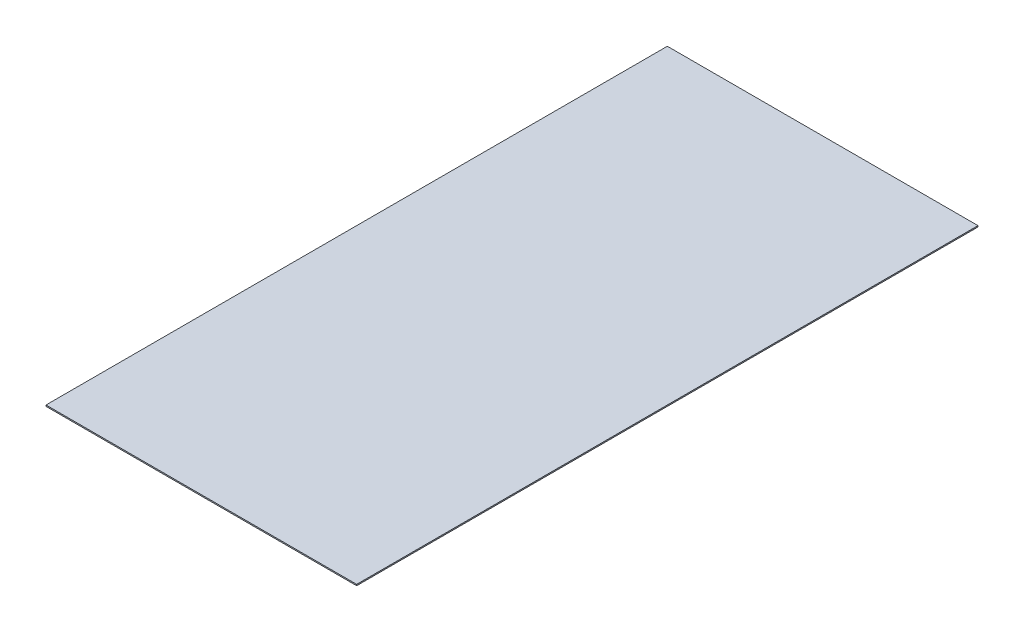
ISO-10303-21;
HEADER;
FILE_DESCRIPTION(('STEP AP214'),'2;1');
FILE_NAME('part.step','',(''),(''),'','','');
FILE_SCHEMA(('AUTOMOTIVE_DESIGN { 1 0 10303 214 1 1 1 1 }'));
ENDSEC;
DATA;
#1=APPLICATION_CONTEXT('core data for automotive mechanical design processes');
#2=APPLICATION_PROTOCOL_DEFINITION('international standard','automotive_design',2000,#1);
#3=PRODUCT_CONTEXT('',#1,'mechanical');
#4=PRODUCT('Part','Part','',(#3));
#5=PRODUCT_RELATED_PRODUCT_CATEGORY('part','',(#4));
#6=PRODUCT_DEFINITION_FORMATION('','',#4);
#7=PRODUCT_DEFINITION_CONTEXT('part definition',#1,'design');
#8=PRODUCT_DEFINITION('design','',#6,#7);
#9=PRODUCT_DEFINITION_SHAPE('','',#8);
#10=(LENGTH_UNIT() NAMED_UNIT(*) SI_UNIT(.MILLI.,.METRE.));
#11=(NAMED_UNIT(*) PLANE_ANGLE_UNIT() SI_UNIT($,.RADIAN.));
#12=(NAMED_UNIT(*) SI_UNIT($,.STERADIAN.) SOLID_ANGLE_UNIT());
#13=UNCERTAINTY_MEASURE_WITH_UNIT(LENGTH_MEASURE(1.E-05),#10,'distance_accuracy_value','');
#14=(GEOMETRIC_REPRESENTATION_CONTEXT(3) GLOBAL_UNCERTAINTY_ASSIGNED_CONTEXT((#13)) GLOBAL_UNIT_ASSIGNED_CONTEXT((#10,
#11,#12)) REPRESENTATION_CONTEXT('',''));
#15=CARTESIAN_POINT('',(0.,0.,0.));
#16=DIRECTION('',(0.,0.,1.));
#17=DIRECTION('',(1.,0.,0.));
#18=AXIS2_PLACEMENT_3D('',#15,#16,#17);
#19=CARTESIAN_POINT('',(609.6,4.8,1219.2));
#20=DIRECTION('',(-1.,0.,0.));
#21=DIRECTION('',(0.,0.,1.));
#22=AXIS2_PLACEMENT_3D('',#19,#20,#21);
#23=PLANE('',#22);
#24=DIRECTION('',(0.,0.,-1.));
#25=VECTOR('',#24,1.);
#26=CARTESIAN_POINT('',(609.6,0.,1219.2));
#27=LINE('',#26,#25);
#28=CARTESIAN_POINT('',(609.6,0.,1219.2));
#29=VERTEX_POINT('',#28);
#30=CARTESIAN_POINT('',(609.6,0.,-1219.2));
#31=VERTEX_POINT('',#30);
#32=EDGE_CURVE('E96',#29,#31,#27,.T.);
#33=ORIENTED_EDGE('',*,*,#32,.T.);
#34=DIRECTION('',(0.,-1.,0.));
#35=VECTOR('',#34,1.);
#36=CARTESIAN_POINT('',(609.6,4.8,-1219.2));
#37=LINE('',#36,#35);
#38=CARTESIAN_POINT('',(609.6,4.8,-1219.2));
#39=VERTEX_POINT('',#38);
#40=EDGE_CURVE('E11',#39,#31,#37,.T.);
#41=ORIENTED_EDGE('',*,*,#40,.F.);
#42=DIRECTION('',(0.,0.,-1.));
#43=VECTOR('',#42,1.);
#44=CARTESIAN_POINT('',(609.6,4.8,1219.2));
#45=LINE('',#44,#43);
#46=CARTESIAN_POINT('',(609.6,4.8,1219.2));
#47=VERTEX_POINT('',#46);
#48=EDGE_CURVE('E84',#47,#39,#45,.T.);
#49=ORIENTED_EDGE('',*,*,#48,.F.);
#50=DIRECTION('',(0.,-1.,0.));
#51=VECTOR('',#50,1.);
#52=CARTESIAN_POINT('',(609.6,4.8,1219.2));
#53=LINE('',#52,#51);
#54=EDGE_CURVE('E92',#47,#29,#53,.T.);
#55=ORIENTED_EDGE('',*,*,#54,.T.);
#56=EDGE_LOOP('',(#33,#41,#49,#55));
#57=FACE_BOUND('',#56,.T.);
#58=ADVANCED_FACE('F33',(#57),#23,.F.);
#59=CARTESIAN_POINT('',(-609.6,4.8,-1219.2));
#60=DIRECTION('',(0.,0.,1.));
#61=DIRECTION('',(1.,0.,0.));
#62=AXIS2_PLACEMENT_3D('',#59,#60,#61);
#63=PLANE('',#62);
#64=DIRECTION('',(-1.,0.,0.));
#65=VECTOR('',#64,1.);
#66=CARTESIAN_POINT('',(-609.6,0.,-1219.2));
#67=LINE('',#66,#65);
#68=CARTESIAN_POINT('',(-609.6,0.,-1219.2));
#69=VERTEX_POINT('',#68);
#70=EDGE_CURVE('E88',#31,#69,#67,.T.);
#71=ORIENTED_EDGE('',*,*,#70,.T.);
#72=DIRECTION('',(0.,-1.,0.));
#73=VECTOR('',#72,1.);
#74=CARTESIAN_POINT('',(-609.6,4.8,-1219.2));
#75=LINE('',#74,#73);
#76=CARTESIAN_POINT('',(-609.6,4.8,-1219.2));
#77=VERTEX_POINT('',#76);
#78=EDGE_CURVE('E41',#77,#69,#75,.T.);
#79=ORIENTED_EDGE('',*,*,#78,.F.);
#80=DIRECTION('',(-1.,0.,0.));
#81=VECTOR('',#80,1.);
#82=CARTESIAN_POINT('',(-609.6,4.8,-1219.2));
#83=LINE('',#82,#81);
#84=EDGE_CURVE('E79',#39,#77,#83,.T.);
#85=ORIENTED_EDGE('',*,*,#84,.F.);
#86=ORIENTED_EDGE('',*,*,#40,.T.);
#87=EDGE_LOOP('',(#71,#79,#85,#86));
#88=FACE_BOUND('',#87,.T.);
#89=ADVANCED_FACE('F87',(#88),#63,.F.);
#90=CARTESIAN_POINT('',(-609.6,4.8,1219.2));
#91=DIRECTION('',(1.,0.,0.));
#92=DIRECTION('',(0.,0.,-1.));
#93=AXIS2_PLACEMENT_3D('',#90,#91,#92);
#94=PLANE('',#93);
#95=DIRECTION('',(0.,0.,1.));
#96=VECTOR('',#95,1.);
#97=CARTESIAN_POINT('',(-609.6,0.,1219.2));
#98=LINE('',#97,#96);
#99=CARTESIAN_POINT('',(-609.6,0.,1219.2));
#100=VERTEX_POINT('',#99);
#101=EDGE_CURVE('E66',#69,#100,#98,.T.);
#102=ORIENTED_EDGE('',*,*,#101,.T.);
#103=DIRECTION('',(0.,-1.,0.));
#104=VECTOR('',#103,1.);
#105=CARTESIAN_POINT('',(-609.6,4.8,1219.2));
#106=LINE('',#105,#104);
#107=CARTESIAN_POINT('',(-609.6,4.8,1219.2));
#108=VERTEX_POINT('',#107);
#109=EDGE_CURVE('E89',#108,#100,#106,.T.);
#110=ORIENTED_EDGE('',*,*,#109,.F.);
#111=DIRECTION('',(0.,0.,1.));
#112=VECTOR('',#111,1.);
#113=CARTESIAN_POINT('',(-609.6,4.8,1219.2));
#114=LINE('',#113,#112);
#115=EDGE_CURVE('E82',#77,#108,#114,.T.);
#116=ORIENTED_EDGE('',*,*,#115,.F.);
#117=ORIENTED_EDGE('',*,*,#78,.T.);
#118=EDGE_LOOP('',(#102,#110,#116,#117));
#119=FACE_BOUND('',#118,.T.);
#120=ADVANCED_FACE('F90',(#119),#94,.F.);
#121=CARTESIAN_POINT('',(-609.6,4.8,1219.2));
#122=DIRECTION('',(0.,0.,-1.));
#123=DIRECTION('',(-1.,0.,0.));
#124=AXIS2_PLACEMENT_3D('',#121,#122,#123);
#125=PLANE('',#124);
#126=DIRECTION('',(1.,0.,0.));
#127=VECTOR('',#126,1.);
#128=CARTESIAN_POINT('',(-609.6,0.,1219.2));
#129=LINE('',#128,#127);
#130=EDGE_CURVE('E72',#100,#29,#129,.T.);
#131=ORIENTED_EDGE('',*,*,#130,.T.);
#132=ORIENTED_EDGE('',*,*,#54,.F.);
#133=DIRECTION('',(1.,0.,0.));
#134=VECTOR('',#133,1.);
#135=CARTESIAN_POINT('',(-609.6,4.8,1219.2));
#136=LINE('',#135,#134);
#137=EDGE_CURVE('E49',#108,#47,#136,.T.);
#138=ORIENTED_EDGE('',*,*,#137,.F.);
#139=ORIENTED_EDGE('',*,*,#109,.T.);
#140=EDGE_LOOP('',(#131,#132,#138,#139));
#141=FACE_BOUND('',#140,.T.);
#142=ADVANCED_FACE('F103',(#141),#125,.F.);
#143=CARTESIAN_POINT('',(0.,4.8,0.));
#144=DIRECTION('',(0.,-1.,0.));
#145=DIRECTION('',(0.,0.,-1.));
#146=AXIS2_PLACEMENT_3D('',#143,#144,#145);
#147=PLANE('',#146);
#148=ORIENTED_EDGE('',*,*,#48,.T.);
#149=ORIENTED_EDGE('',*,*,#84,.T.);
#150=ORIENTED_EDGE('',*,*,#115,.T.);
#151=ORIENTED_EDGE('',*,*,#137,.T.);
#152=EDGE_LOOP('',(#148,#149,#150,#151));
#153=FACE_BOUND('',#152,.T.);
#154=ADVANCED_FACE('F80',(#153),#147,.F.);
#155=CARTESIAN_POINT('',(0.,0.,0.));
#156=DIRECTION('',(0.,-1.,0.));
#157=DIRECTION('',(0.,0.,-1.));
#158=AXIS2_PLACEMENT_3D('',#155,#156,#157);
#159=PLANE('',#158);
#160=ORIENTED_EDGE('',*,*,#32,.F.);
#161=ORIENTED_EDGE('',*,*,#130,.F.);
#162=ORIENTED_EDGE('',*,*,#101,.F.);
#163=ORIENTED_EDGE('',*,*,#70,.F.);
#164=EDGE_LOOP('',(#160,#161,#162,#163));
#165=FACE_BOUND('',#164,.T.);
#166=ADVANCED_FACE('F106',(#165),#159,.T.);
#167=CLOSED_SHELL('',(#58,#89,#120,#142,#154,#166));
#168=MANIFOLD_SOLID_BREP('B2',#167);
#169=ADVANCED_BREP_SHAPE_REPRESENTATION('',(#18,#168),#14);
#170=SHAPE_DEFINITION_REPRESENTATION(#9,#169);
ENDSEC;
END-ISO-10303-21;
